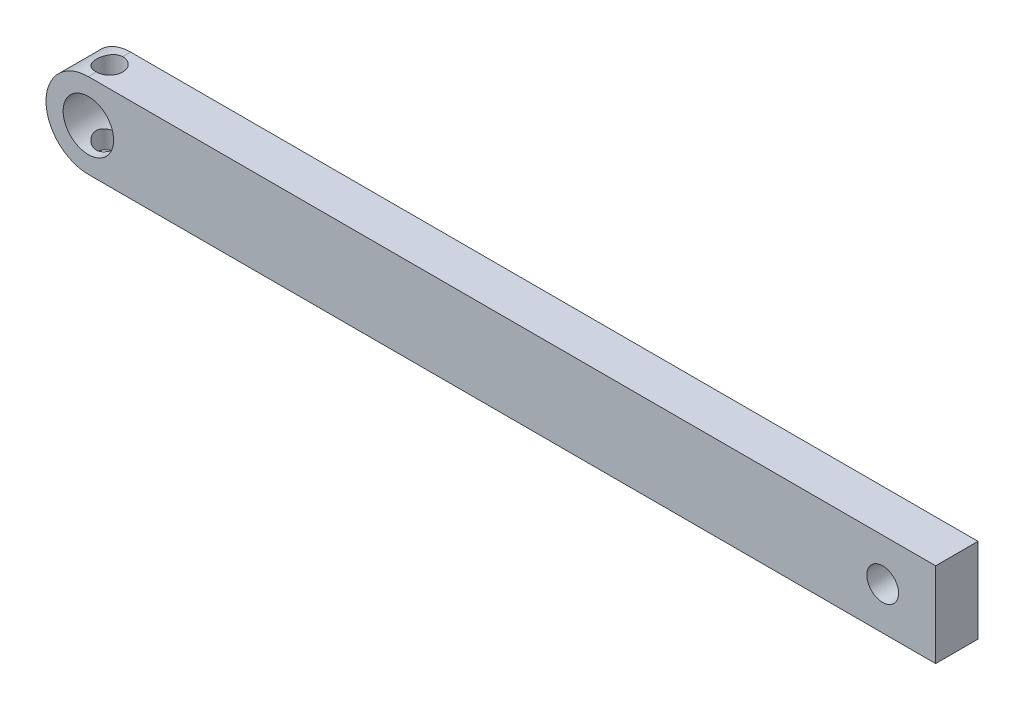
ISO-10303-21;
HEADER;
FILE_DESCRIPTION(('STEP AP214'),'2;1');
FILE_NAME('part.step','',(''),(''),'','','');
FILE_SCHEMA(('AUTOMOTIVE_DESIGN { 1 0 10303 214 1 1 1 1 }'));
ENDSEC;
DATA;
#1=APPLICATION_CONTEXT('core data for automotive mechanical design processes');
#2=APPLICATION_PROTOCOL_DEFINITION('international standard','automotive_design',2000,#1);
#3=PRODUCT_CONTEXT('',#1,'mechanical');
#4=PRODUCT('Part','Part','',(#3));
#5=PRODUCT_RELATED_PRODUCT_CATEGORY('part','',(#4));
#6=PRODUCT_DEFINITION_FORMATION('','',#4);
#7=PRODUCT_DEFINITION_CONTEXT('part definition',#1,'design');
#8=PRODUCT_DEFINITION('design','',#6,#7);
#9=PRODUCT_DEFINITION_SHAPE('','',#8);
#10=(LENGTH_UNIT() NAMED_UNIT(*) SI_UNIT(.MILLI.,.METRE.));
#11=(NAMED_UNIT(*) PLANE_ANGLE_UNIT() SI_UNIT($,.RADIAN.));
#12=(NAMED_UNIT(*) SI_UNIT($,.STERADIAN.) SOLID_ANGLE_UNIT());
#13=UNCERTAINTY_MEASURE_WITH_UNIT(LENGTH_MEASURE(1.E-05),#10,'distance_accuracy_value','');
#14=(GEOMETRIC_REPRESENTATION_CONTEXT(3) GLOBAL_UNCERTAINTY_ASSIGNED_CONTEXT((#13)) GLOBAL_UNIT_ASSIGNED_CONTEXT((#10,
#11,#12)) REPRESENTATION_CONTEXT('',''));
#15=CARTESIAN_POINT('',(0.,0.,0.));
#16=DIRECTION('',(0.,0.,1.));
#17=DIRECTION('',(1.,0.,0.));
#18=AXIS2_PLACEMENT_3D('',#15,#16,#17);
#19=CARTESIAN_POINT('',(0.,0.,8.00000000000001));
#20=DIRECTION('',(0.,0.,-1.));
#21=DIRECTION('',(-1.,0.,0.));
#22=AXIS2_PLACEMENT_3D('',#19,#20,#21);
#23=CYLINDRICAL_SURFACE('',#22,8.);
#24=DIRECTION('',(0.,0.,-1.));
#25=VECTOR('',#24,1.);
#26=CARTESIAN_POINT('',(0.,8.00000000000001,8.00000000000001));
#27=LINE('',#26,#25);
#28=CARTESIAN_POINT('',(0.,8.00000000000001,8.00000000000001));
#29=VERTEX_POINT('',#28);
#30=CARTESIAN_POINT('',(0.,8.00000000000001,6.50000000000001));
#31=VERTEX_POINT('',#30);
#32=EDGE_CURVE('E107',#29,#31,#27,.T.);
#33=ORIENTED_EDGE('',*,*,#32,.T.);
#34=CARTESIAN_POINT('',(0.,8.00000000000001,6.50000000000001));
#35=CARTESIAN_POINT('',(-0.0685487375897861,8.00000828551833,6.50000852601127));
#36=CARTESIAN_POINT('',(-0.137092243271783,7.9991191440238,6.49718079886828));
#37=CARTESIAN_POINT('',(-0.273658462709296,7.99560760801552,6.48591902577308));
#38=CARTESIAN_POINT('',(-0.341681282702897,7.99298557715255,6.47748615607071));
#39=CARTESIAN_POINT('',(-0.476556396287234,7.98607844882145,6.45510820487387));
#40=CARTESIAN_POINT('',(-0.543411188332166,7.98179751992038,6.44117693843149));
#41=CARTESIAN_POINT('',(-0.675634097513508,7.97169515696953,6.40793933067783));
#42=CARTESIAN_POINT('',(-0.741002181869404,7.96587368898799,6.38863287097261));
#43=CARTESIAN_POINT('',(-0.934159566213668,7.94632105573205,6.32288580706774));
#44=CARTESIAN_POINT('',(-1.05916451444987,7.9304927927943,6.26859025811366));
#45=CARTESIAN_POINT('',(-1.29825956099428,7.89488403622455,6.14078064523646));
#46=CARTESIAN_POINT('',(-1.41234491586354,7.87510183643384,6.06725828053436));
#47=CARTESIAN_POINT('',(-1.62992185834525,7.83300504863904,5.90069158717585));
#48=CARTESIAN_POINT('',(-1.73303308369391,7.81063554499911,5.80716348112159));
#49=CARTESIAN_POINT('',(-1.92239185222163,7.76620202095561,5.60426855583532));
#50=CARTESIAN_POINT('',(-2.00863537601001,7.74413807452404,5.49489797229329));
#51=CARTESIAN_POINT('',(-2.16388806855929,7.70222242976766,5.26010828060368));
#52=CARTESIAN_POINT('',(-2.23241866885748,7.68243887545916,5.1343593692775));
#53=CARTESIAN_POINT('',(-2.3471970391182,7.64815537243525,4.8724091713225));
#54=CARTESIAN_POINT('',(-2.39345168311052,7.63365379411742,4.73621112420152));
#55=CARTESIAN_POINT('',(-2.46096881223998,7.61215225423915,4.46154529903334));
#56=CARTESIAN_POINT('',(-2.48294172478264,7.60493961151813,4.32326926995985));
#57=CARTESIAN_POINT('',(-2.50349113691374,7.59820109395765,4.04481675400958));
#58=CARTESIAN_POINT('',(-2.5020733589136,7.59867333904976,3.90464074033881));
#59=CARTESIAN_POINT('',(-2.47643642308412,7.60706380493777,3.63225031409493));
#60=CARTESIAN_POINT('',(-2.45312089723513,7.61468692290453,3.49994023202207));
#61=CARTESIAN_POINT('',(-2.38581575576351,7.63604066973849,3.24121423761495));
#62=CARTESIAN_POINT('',(-2.34182417905605,7.64977187794003,3.11479888563529));
#63=CARTESIAN_POINT('',(-2.2337772364259,7.68202096695246,2.86929545704555));
#64=CARTESIAN_POINT('',(-2.16943794916688,7.70060589200765,2.75034152089711));
#65=CARTESIAN_POINT('',(-2.0227194142874,7.74043735773375,2.5246233151796));
#66=CARTESIAN_POINT('',(-1.94033567192367,7.7616845609936,2.41786209282603));
#67=CARTESIAN_POINT('',(-1.75544295442941,7.80562852096723,2.21445957784168));
#68=CARTESIAN_POINT('',(-1.6521896856372,7.82834727778429,2.11849843121897));
#69=CARTESIAN_POINT('',(-1.43074855532243,7.8718276191842,1.94507021527006));
#70=CARTESIAN_POINT('',(-1.31255688667029,7.89258870248027,1.86760787505452));
#71=CARTESIAN_POINT('',(-1.06326270590143,7.93003694109363,1.73290548098959));
#72=CARTESIAN_POINT('',(-0.932061262110442,7.94668888732126,1.67583843937543));
#73=CARTESIAN_POINT('',(-0.661347031903778,7.97377122873637,1.58485251978696));
#74=CARTESIAN_POINT('',(-0.521846759382405,7.98421074263933,1.55089970375208));
#75=CARTESIAN_POINT('',(-0.317524974590987,7.9939469560764,1.51942462400281));
#76=CARTESIAN_POINT('',(-0.254213573128759,7.99621235684532,1.51214152080404));
#77=CARTESIAN_POINT('',(-0.12727891834249,7.99923898062172,1.50243337115787));
#78=CARTESIAN_POINT('',(-0.0636562717724465,8.00000244442139,1.50000108752866));
#79=CARTESIAN_POINT('',(0.,8.00000000000004,1.49999999999989));
#80=B_SPLINE_CURVE_WITH_KNOTS('',3,(#34,#35,#36,#37,#38,#39,#40,#41,#42,#43,#44,#45,#46,#47,#48,
#49,#50,#51,#52,#53,#54,#55,#56,#57,#58,#59,#60,#61,#62,#63,#64,#65,#66,#67,#68,#69,#70,#71,#72,
#73,#74,#75,#76,#77,#78,#79),.UNSPECIFIED.,.F.,.F.,(4,2,2,2,2,2,2,2,2,2,2,2,2,2,2,2,2,2,2,2,2,2,
4),(0.,0.205573209983583,0.411103293652321,0.616120224939462,0.821141672284207,1.23069571854254,
1.64042687401617,2.06149251997569,2.4826583794019,2.91423219989317,3.34567275763244,
3.76412558310411,4.18247603777546,4.58428767511492,4.98613743123137,5.3938620529683,
5.80168835169545,6.22804332521303,6.6545071774636,7.08450732623744,7.51387474652565,
7.7050115487477,7.89586297038672),.UNSPECIFIED.);
#81=CARTESIAN_POINT('',(0.,8.00000000000001,1.5));
#82=VERTEX_POINT('',#81);
#83=EDGE_CURVE('E70',#31,#82,#80,.T.);
#84=ORIENTED_EDGE('',*,*,#83,.T.);
#85=CARTESIAN_POINT('',(0.,8.00000000000001,0.));
#86=VERTEX_POINT('',#85);
#87=EDGE_CURVE('E104',#82,#86,#27,.T.);
#88=ORIENTED_EDGE('',*,*,#87,.T.);
#89=CARTESIAN_POINT('',(0.,0.,0.));
#90=DIRECTION('',(0.,0.,1.));
#91=DIRECTION('',(1.,0.,0.));
#92=AXIS2_PLACEMENT_3D('',#89,#90,#91);
#93=CIRCLE('',#92,8.);
#94=CARTESIAN_POINT('',(0.,-7.99999999999979,0.));
#95=VERTEX_POINT('',#94);
#96=EDGE_CURVE('E174',#86,#95,#93,.T.);
#97=ORIENTED_EDGE('',*,*,#96,.T.);
#98=DIRECTION('',(0.,0.,-1.));
#99=VECTOR('',#98,1.);
#100=CARTESIAN_POINT('',(0.,-7.99999999999977,8.00000000000001));
#101=LINE('',#100,#99);
#102=CARTESIAN_POINT('',(0.,-7.99999999999979,1.5));
#103=VERTEX_POINT('',#102);
#104=EDGE_CURVE('E52',#103,#95,#101,.T.);
#105=ORIENTED_EDGE('',*,*,#104,.F.);
#106=CARTESIAN_POINT('',(0.,-7.99999999999979,1.5));
#107=CARTESIAN_POINT('',(-0.0685487375898396,-8.00000828551826,1.49999147398843));
#108=CARTESIAN_POINT('',(-0.137092243271868,-7.99911914402379,1.50281920113132));
#109=CARTESIAN_POINT('',(-0.273658462709395,-7.99560760801553,1.51408097422646));
#110=CARTESIAN_POINT('',(-0.341681282702979,-7.99298557715254,1.52251384392888));
#111=CARTESIAN_POINT('',(-0.476556396287318,-7.98607844882145,1.5448917951257));
#112=CARTESIAN_POINT('',(-0.543411188332272,-7.98179751992042,1.55882306156801));
#113=CARTESIAN_POINT('',(-0.675634097513566,-7.97169515696948,1.59206066932184));
#114=CARTESIAN_POINT('',(-0.741002181869393,-7.96587368898782,1.61136712902731));
#115=CARTESIAN_POINT('',(-0.934159566213624,-7.94632105573176,1.67711419293244));
#116=CARTESIAN_POINT('',(-1.05916451445006,-7.93049279279426,1.73140974188606));
#117=CARTESIAN_POINT('',(-1.29825956099448,-7.89488403622454,1.85921935476314));
#118=CARTESIAN_POINT('',(-1.41234491586352,-7.87510183643364,1.93274171946558));
#119=CARTESIAN_POINT('',(-1.62992185834524,-7.8330050486388,2.09930841282422));
#120=CARTESIAN_POINT('',(-1.73303308369413,-7.81063554499905,2.19283651887826));
#121=CARTESIAN_POINT('',(-1.92239185222187,-7.76620202095556,2.39573144416445));
#122=CARTESIAN_POINT('',(-2.00863537601003,-7.74413807452381,2.50510202770664));
#123=CARTESIAN_POINT('',(-2.16388806855926,-7.70222242976743,2.73989171939635));
#124=CARTESIAN_POINT('',(-2.23241866885763,-7.68243887545912,2.86564063072245));
#125=CARTESIAN_POINT('',(-2.34719703911838,-7.64815537243519,3.12759082867743));
#126=CARTESIAN_POINT('',(-2.39345168311057,-7.63365379411717,3.26378887579846));
#127=CARTESIAN_POINT('',(-2.46096881223994,-7.61215225423893,3.53845470096668));
#128=CARTESIAN_POINT('',(-2.48294172478265,-7.60493961151812,3.67673073004017));
#129=CARTESIAN_POINT('',(-2.50349113691379,-7.59820109395763,3.95518324599043));
#130=CARTESIAN_POINT('',(-2.50207335891365,-7.59867333904953,4.09535925966122));
#131=CARTESIAN_POINT('',(-2.47643642308408,-7.60706380493757,4.36774968590506));
#132=CARTESIAN_POINT('',(-2.45312089723501,-7.61468692290457,4.50005976797787));
#133=CARTESIAN_POINT('',(-2.38581575576342,-7.63604066973852,4.75878576238503));
#134=CARTESIAN_POINT('',(-2.34182417905608,-7.6497718779398,4.88520111436476));
#135=CARTESIAN_POINT('',(-2.23377723642588,-7.68202096695224,5.13070454295442));
#136=CARTESIAN_POINT('',(-2.16943794916669,-7.7006058920077,5.24965847910271));
#137=CARTESIAN_POINT('',(-2.02271941428722,-7.74043735773381,5.47537668482026));
#138=CARTESIAN_POINT('',(-1.94033567192367,-7.76168456099341,5.58213790717402));
#139=CARTESIAN_POINT('',(-1.75544295442942,-7.80562852096701,5.78554042215829));
#140=CARTESIAN_POINT('',(-1.65218968563702,-7.82834727778433,5.88150156878072));
#141=CARTESIAN_POINT('',(-1.43074855532224,-7.87182761918424,6.05492978472967));
#142=CARTESIAN_POINT('',(-1.31255688667027,-7.89258870248006,6.13239212494553));
#143=CARTESIAN_POINT('',(-1.06326270590145,-7.93003694109342,6.26709451901037));
#144=CARTESIAN_POINT('',(-0.932061262110334,-7.9466888873213,6.32416156062411));
#145=CARTESIAN_POINT('',(-0.661347031903657,-7.97377122873635,6.41514748021271));
#146=CARTESIAN_POINT('',(-0.5218467593824,-7.98421074263901,6.44910029624814));
#147=CARTESIAN_POINT('',(-0.317524974590986,-7.99394695607622,6.48057537599711));
#148=CARTESIAN_POINT('',(-0.254213573128736,-7.99621235684527,6.48785847919563));
#149=CARTESIAN_POINT('',(-0.127278918342441,-7.99923898062177,6.4975666288416));
#150=CARTESIAN_POINT('',(-0.0636562717723951,-8.00000244442142,6.49999891247085));
#151=CARTESIAN_POINT('',(0.,-7.99999999999981,6.50000000000012));
#152=B_SPLINE_CURVE_WITH_KNOTS('',3,(#106,#107,#108,#109,#110,#111,#112,#113,#114,#115,#116,
#117,#118,#119,#120,#121,#122,#123,#124,#125,#126,#127,#128,#129,#130,#131,#132,#133,#134,#135,
#136,#137,#138,#139,#140,#141,#142,#143,#144,#145,#146,#147,#148,#149,#150,#151),.UNSPECIFIED.,
.F.,.F.,(4,2,2,2,2,2,2,2,2,2,2,2,2,2,2,2,2,2,2,2,2,2,4),(0.,0.205573209983675,0.411103293652379,
0.616120224939516,0.821141672284316,1.23069571854268,1.64042687401635,2.06149251997589,
2.48265837940212,2.91423219989341,3.3456727576327,3.76412558310437,4.18247603777573,
4.58428767511517,4.9861374312316,5.39386205296851,5.80168835169564,6.2280433252132,
6.65450717746373,7.08450732623754,7.51387474652573,7.70501154874777,7.89586297038678),.UNSPECIFIED.);
#153=CARTESIAN_POINT('',(0.,-7.99999999999979,6.50000000000001));
#154=VERTEX_POINT('',#153);
#155=EDGE_CURVE('E58',#103,#154,#152,.T.);
#156=ORIENTED_EDGE('',*,*,#155,.T.);
#157=CARTESIAN_POINT('',(0.,-7.99999999999977,8.00000000000001));
#158=VERTEX_POINT('',#157);
#159=EDGE_CURVE('E11',#158,#154,#101,.T.);
#160=ORIENTED_EDGE('',*,*,#159,.F.);
#161=CARTESIAN_POINT('',(0.,0.,8.00000000000001));
#162=DIRECTION('',(0.,0.,1.));
#163=DIRECTION('',(1.,0.,0.));
#164=AXIS2_PLACEMENT_3D('',#161,#162,#163);
#165=CIRCLE('',#164,8.);
#166=EDGE_CURVE('E172',#29,#158,#165,.T.);
#167=ORIENTED_EDGE('',*,*,#166,.F.);
#168=EDGE_LOOP('',(#33,#84,#88,#97,#105,#156,#160,#167));
#169=FACE_BOUND('',#168,.T.);
#170=ADVANCED_FACE('F39',(#169),#23,.T.);
#171=CARTESIAN_POINT('',(0.,-7.99999999999977,8.00000000000001));
#172=DIRECTION('',(0.,1.,0.));
#173=DIRECTION('',(0.,0.,1.));
#174=AXIS2_PLACEMENT_3D('',#171,#172,#173);
#175=PLANE('',#174);
#176=ORIENTED_EDGE('',*,*,#159,.T.);
#177=CARTESIAN_POINT('',(0.,-7.99999999999979,4.));
#178=DIRECTION('',(0.,1.,0.));
#179=DIRECTION('',(0.,0.,1.));
#180=AXIS2_PLACEMENT_3D('',#177,#178,#179);
#181=CIRCLE('',#180,2.5);
#182=EDGE_CURVE('E108',#154,#103,#181,.T.);
#183=ORIENTED_EDGE('',*,*,#182,.T.);
#184=ORIENTED_EDGE('',*,*,#104,.T.);
#185=DIRECTION('',(1.,0.,0.));
#186=VECTOR('',#185,1.);
#187=CARTESIAN_POINT('',(0.,-7.99999999999979,0.));
#188=LINE('',#187,#186);
#189=CARTESIAN_POINT('',(160.,-7.99999999999977,0.));
#190=VERTEX_POINT('',#189);
#191=EDGE_CURVE('E185',#95,#190,#188,.T.);
#192=ORIENTED_EDGE('',*,*,#191,.T.);
#193=DIRECTION('',(0.,0.,-1.));
#194=VECTOR('',#193,1.);
#195=CARTESIAN_POINT('',(160.,-7.99999999999977,8.00000000000001));
#196=LINE('',#195,#194);
#197=CARTESIAN_POINT('',(160.,-7.99999999999977,8.00000000000001));
#198=VERTEX_POINT('',#197);
#199=EDGE_CURVE('E124',#198,#190,#196,.T.);
#200=ORIENTED_EDGE('',*,*,#199,.F.);
#201=DIRECTION('',(1.,0.,0.));
#202=VECTOR('',#201,1.);
#203=CARTESIAN_POINT('',(0.,-7.99999999999977,8.00000000000001));
#204=LINE('',#203,#202);
#205=EDGE_CURVE('E176',#158,#198,#204,.T.);
#206=ORIENTED_EDGE('',*,*,#205,.F.);
#207=EDGE_LOOP('',(#176,#183,#184,#192,#200,#206));
#208=FACE_BOUND('',#207,.T.);
#209=ADVANCED_FACE('F197',(#208),#175,.F.);
#210=CARTESIAN_POINT('',(160.,-7.99999999999977,8.00000000000001));
#211=DIRECTION('',(-1.,0.,0.));
#212=DIRECTION('',(0.,0.,1.));
#213=AXIS2_PLACEMENT_3D('',#210,#211,#212);
#214=PLANE('',#213);
#215=DIRECTION('',(0.,1.,0.));
#216=VECTOR('',#215,1.);
#217=CARTESIAN_POINT('',(160.,-7.99999999999977,0.));
#218=LINE('',#217,#216);
#219=CARTESIAN_POINT('',(160.,8.0000000000002,0.));
#220=VERTEX_POINT('',#219);
#221=EDGE_CURVE('E181',#190,#220,#218,.T.);
#222=ORIENTED_EDGE('',*,*,#221,.T.);
#223=DIRECTION('',(0.,0.,-1.));
#224=VECTOR('',#223,1.);
#225=CARTESIAN_POINT('',(160.,8.00000000000023,8.00000000000001));
#226=LINE('',#225,#224);
#227=CARTESIAN_POINT('',(160.,8.00000000000023,8.00000000000001));
#228=VERTEX_POINT('',#227);
#229=EDGE_CURVE('E116',#228,#220,#226,.T.);
#230=ORIENTED_EDGE('',*,*,#229,.F.);
#231=DIRECTION('',(0.,1.,0.));
#232=VECTOR('',#231,1.);
#233=CARTESIAN_POINT('',(160.,-7.99999999999977,8.00000000000001));
#234=LINE('',#233,#232);
#235=EDGE_CURVE('E119',#198,#228,#234,.T.);
#236=ORIENTED_EDGE('',*,*,#235,.F.);
#237=ORIENTED_EDGE('',*,*,#199,.T.);
#238=EDGE_LOOP('',(#222,#230,#236,#237));
#239=FACE_BOUND('',#238,.T.);
#240=ADVANCED_FACE('F190',(#239),#214,.F.);
#241=CARTESIAN_POINT('',(160.,8.00000000000023,8.00000000000001));
#242=DIRECTION('',(0.,-1.,0.));
#243=DIRECTION('',(0.,0.,-1.));
#244=AXIS2_PLACEMENT_3D('',#241,#242,#243);
#245=PLANE('',#244);
#246=ORIENTED_EDGE('',*,*,#87,.F.);
#247=CARTESIAN_POINT('',(0.,8.00000000000001,4.));
#248=DIRECTION('',(0.,-1.,0.));
#249=DIRECTION('',(0.,0.,-1.));
#250=AXIS2_PLACEMENT_3D('',#247,#248,#249);
#251=CIRCLE('',#250,2.5);
#252=EDGE_CURVE('E96',#82,#31,#251,.T.);
#253=ORIENTED_EDGE('',*,*,#252,.T.);
#254=ORIENTED_EDGE('',*,*,#32,.F.);
#255=DIRECTION('',(-1.,0.,0.));
#256=VECTOR('',#255,1.);
#257=CARTESIAN_POINT('',(160.,8.00000000000023,8.00000000000001));
#258=LINE('',#257,#256);
#259=EDGE_CURVE('E118',#228,#29,#258,.T.);
#260=ORIENTED_EDGE('',*,*,#259,.F.);
#261=ORIENTED_EDGE('',*,*,#229,.T.);
#262=DIRECTION('',(-1.,0.,0.));
#263=VECTOR('',#262,1.);
#264=CARTESIAN_POINT('',(160.,8.0000000000002,0.));
#265=LINE('',#264,#263);
#266=EDGE_CURVE('E111',#220,#86,#265,.T.);
#267=ORIENTED_EDGE('',*,*,#266,.T.);
#268=EDGE_LOOP('',(#246,#253,#254,#260,#261,#267));
#269=FACE_BOUND('',#268,.T.);
#270=ADVANCED_FACE('F112',(#269),#245,.F.);
#271=CARTESIAN_POINT('',(0.,0.,8.00000000000001));
#272=DIRECTION('',(0.,0.,1.));
#273=DIRECTION('',(1.,0.,0.));
#274=AXIS2_PLACEMENT_3D('',#271,#272,#273);
#275=PLANE('',#274);
#276=CARTESIAN_POINT('',(0.,0.,8.00000000000001));
#277=DIRECTION('',(0.,0.,1.));
#278=DIRECTION('',(1.,0.,0.));
#279=AXIS2_PLACEMENT_3D('',#276,#277,#278);
#280=CIRCLE('',#279,4.7625);
#281=CARTESIAN_POINT('',(4.7625,0.,8.00000000000001));
#282=VERTEX_POINT('',#281);
#283=EDGE_CURVE('E138',#282,#282,#280,.T.);
#284=ORIENTED_EDGE('',*,*,#283,.F.);
#285=EDGE_LOOP('',(#284));
#286=FACE_BOUND('',#285,.T.);
#287=CARTESIAN_POINT('',(150.,2.22044604925031E-13,8.00000000000001));
#288=DIRECTION('',(0.,0.,1.));
#289=DIRECTION('',(1.,0.,0.));
#290=AXIS2_PLACEMENT_3D('',#287,#288,#289);
#291=CIRCLE('',#290,2.99999999999999);
#292=CARTESIAN_POINT('',(153.,2.22044604925031E-13,8.00000000000001));
#293=VERTEX_POINT('',#292);
#294=EDGE_CURVE('E133',#293,#293,#291,.T.);
#295=ORIENTED_EDGE('',*,*,#294,.F.);
#296=EDGE_LOOP('',(#295));
#297=FACE_BOUND('',#296,.T.);
#298=ORIENTED_EDGE('',*,*,#166,.T.);
#299=ORIENTED_EDGE('',*,*,#205,.T.);
#300=ORIENTED_EDGE('',*,*,#235,.T.);
#301=ORIENTED_EDGE('',*,*,#259,.T.);
#302=EDGE_LOOP('',(#298,#299,#300,#301));
#303=FACE_BOUND('',#302,.T.);
#304=ADVANCED_FACE('F200',(#286,#297,#303),#275,.T.);
#305=CARTESIAN_POINT('',(0.,0.,0.));
#306=DIRECTION('',(0.,0.,1.));
#307=DIRECTION('',(1.,0.,0.));
#308=AXIS2_PLACEMENT_3D('',#305,#306,#307);
#309=PLANE('',#308);
#310=CARTESIAN_POINT('',(30.,0.,0.));
#311=DIRECTION('',(0.,0.,1.));
#312=DIRECTION('',(1.,0.,0.));
#313=AXIS2_PLACEMENT_3D('',#310,#311,#312);
#314=CIRCLE('',#313,4.00000000000001);
#315=CARTESIAN_POINT('',(34.,0.,0.));
#316=VERTEX_POINT('',#315);
#317=EDGE_CURVE('E135',#316,#316,#314,.T.);
#318=ORIENTED_EDGE('',*,*,#317,.T.);
#319=EDGE_LOOP('',(#318));
#320=FACE_BOUND('',#319,.T.);
#321=CARTESIAN_POINT('',(0.,0.,0.));
#322=DIRECTION('',(0.,0.,1.));
#323=DIRECTION('',(1.,0.,0.));
#324=AXIS2_PLACEMENT_3D('',#321,#322,#323);
#325=CIRCLE('',#324,4.7625);
#326=CARTESIAN_POINT('',(4.7625,0.,0.));
#327=VERTEX_POINT('',#326);
#328=EDGE_CURVE('E131',#327,#327,#325,.T.);
#329=ORIENTED_EDGE('',*,*,#328,.T.);
#330=EDGE_LOOP('',(#329));
#331=FACE_BOUND('',#330,.T.);
#332=CARTESIAN_POINT('',(150.,2.22044604925031E-13,0.));
#333=DIRECTION('',(0.,0.,1.));
#334=DIRECTION('',(1.,0.,0.));
#335=AXIS2_PLACEMENT_3D('',#332,#333,#334);
#336=CIRCLE('',#335,2.99999999999999);
#337=CARTESIAN_POINT('',(153.,2.22044604925031E-13,0.));
#338=VERTEX_POINT('',#337);
#339=EDGE_CURVE('E126',#338,#338,#336,.T.);
#340=ORIENTED_EDGE('',*,*,#339,.T.);
#341=EDGE_LOOP('',(#340));
#342=FACE_BOUND('',#341,.T.);
#343=ORIENTED_EDGE('',*,*,#96,.F.);
#344=ORIENTED_EDGE('',*,*,#266,.F.);
#345=ORIENTED_EDGE('',*,*,#221,.F.);
#346=ORIENTED_EDGE('',*,*,#191,.F.);
#347=EDGE_LOOP('',(#343,#344,#345,#346));
#348=FACE_BOUND('',#347,.T.);
#349=ADVANCED_FACE('F191',(#320,#331,#342,#348),#309,.F.);
#350=CARTESIAN_POINT('',(150.,2.22044604925031E-13,-20.0000000000001));
#351=DIRECTION('',(0.,0.,1.));
#352=DIRECTION('',(1.,0.,0.));
#353=AXIS2_PLACEMENT_3D('',#350,#351,#352);
#354=CYLINDRICAL_SURFACE('',#353,2.99999999999999);
#355=ORIENTED_EDGE('',*,*,#294,.T.);
#356=EDGE_LOOP('',(#355));
#357=FACE_BOUND('',#356,.T.);
#358=ORIENTED_EDGE('',*,*,#339,.F.);
#359=EDGE_LOOP('',(#358));
#360=FACE_BOUND('',#359,.T.);
#361=ADVANCED_FACE('F208',(#357,#360),#354,.F.);
#362=CARTESIAN_POINT('',(0.,0.,-20.0000000000001));
#363=DIRECTION('',(0.,0.,1.));
#364=DIRECTION('',(1.,0.,0.));
#365=AXIS2_PLACEMENT_3D('',#362,#363,#364);
#366=CYLINDRICAL_SURFACE('',#365,4.7625);
#367=CARTESIAN_POINT('',(0.,-4.76249999999978,6.50000000000001));
#368=CARTESIAN_POINT('',(-0.130627421225199,-4.7624912423158,6.49998987345156));
#369=CARTESIAN_POINT('',(-0.261392577954281,-4.75706877903839,6.4897011265117));
#370=CARTESIAN_POINT('',(-0.51900445088768,-4.73590787240181,6.44902144651768));
#371=CARTESIAN_POINT('',(-0.645844384851272,-4.7201525152521,6.41859755373719));
#372=CARTESIAN_POINT('',(-0.891501022140095,-4.67996420289099,6.33919283263622));
#373=CARTESIAN_POINT('',(-1.01034767016372,-4.65556606099747,6.29028640030535));
#374=CARTESIAN_POINT('',(-1.2379438202076,-4.6002867022367,6.17571688829303));
#375=CARTESIAN_POINT('',(-1.34669348083588,-4.56940558723178,6.11005407188919));
#376=CARTESIAN_POINT('',(-1.55892133995745,-4.50159635346766,5.95903300840501));
#377=CARTESIAN_POINT('',(-1.66160312776816,-4.46440625290162,5.87267527303705));
#378=CARTESIAN_POINT('',(-1.85177188990189,-4.38894458289408,5.68487950619877));
#379=CARTESIAN_POINT('',(-1.93924600469647,-4.35067212970637,5.58342884544023));
#380=CARTESIAN_POINT('',(-2.10422763598032,-4.27348021423747,5.35773768357491));
#381=CARTESIAN_POINT('',(-2.18018973516788,-4.23479802820829,5.23227908494838));
#382=CARTESIAN_POINT('',(-2.30963791504333,-4.16562294885068,4.96804993693213));
#383=CARTESIAN_POINT('',(-2.36314108926499,-4.13512383377318,4.82928961068694));
#384=CARTESIAN_POINT('',(-2.42324895025029,-4.09996952403738,4.61869668339688));
#385=CARTESIAN_POINT('',(-2.43967751578651,-4.09018641832969,4.55039690148345));
#386=CARTESIAN_POINT('',(-2.46677009527981,-4.07390549926451,4.41229300246428));
#387=CARTESIAN_POINT('',(-2.47743732586378,-4.06740585284111,4.34248974745268));
#388=CARTESIAN_POINT('',(-2.4928228070298,-4.05799501167304,4.20204144086744));
#389=CARTESIAN_POINT('',(-2.49754557969259,-4.05508108922652,4.13139707049882));
#390=CARTESIAN_POINT('',(-2.50098217922734,-4.05296092161596,3.98992993238122));
#391=CARTESIAN_POINT('',(-2.49969669147793,-4.0537542535553,3.91910718590124));
#392=CARTESIAN_POINT('',(-2.48799202626699,-4.06096295843848,3.72652657877533));
#393=CARTESIAN_POINT('',(-2.47160741979413,-4.07104911907529,3.60520413914163));
#394=CARTESIAN_POINT('',(-2.42171169462485,-4.10091839522591,3.36745556765119));
#395=CARTESIAN_POINT('',(-2.38819409172341,-4.1207051819516,3.25103130764252));
#396=CARTESIAN_POINT('',(-2.30445419048025,-4.16812330580348,3.0229734463351));
#397=CARTESIAN_POINT('',(-2.25386859885837,-4.19592314410563,2.9115094942428));
#398=CARTESIAN_POINT('',(-2.13771806028817,-4.25627134083851,2.69810002860173));
#399=CARTESIAN_POINT('',(-2.07214642279414,-4.28882181784705,2.59615879521024));
#400=CARTESIAN_POINT('',(-1.91707717493104,-4.36056222368119,2.38947796353902));
#401=CARTESIAN_POINT('',(-1.82550601334383,-4.40003945957635,2.28638795479857));
#402=CARTESIAN_POINT('',(-1.62631292573431,-4.47749235013777,2.09630005668344));
#403=CARTESIAN_POINT('',(-1.51868183519854,-4.51546713167985,2.00931141938992));
#404=CARTESIAN_POINT('',(-1.28285311381232,-4.58821726237061,1.84925644738104));
#405=CARTESIAN_POINT('',(-1.15384113644337,-4.62269422182366,1.77724297891855));
#406=CARTESIAN_POINT('',(-0.883274583487487,-4.68191671322411,1.65655951919258));
#407=CARTESIAN_POINT('',(-0.74173102174264,-4.7066706885483,1.60786926609566));
#408=CARTESIAN_POINT('',(-0.463482648356793,-4.74178157874737,1.53954031968046));
#409=CARTESIAN_POINT('',(-0.327451533146038,-4.7532154346413,1.51771868966592));
#410=CARTESIAN_POINT('',(-0.0532027411688885,-4.76417535094782,1.49679213134935));
#411=CARTESIAN_POINT('',(0.0850136913179716,-4.76370795984328,1.49767471039916));
#412=CARTESIAN_POINT('',(0.346844432807818,-4.75150400862076,1.52099639780689));
#413=CARTESIAN_POINT('',(0.470680368684716,-4.74075451239976,1.54154746222716));
#414=CARTESIAN_POINT('',(0.712860226199099,-4.710428305764,1.60054849782005));
#415=CARTESIAN_POINT('',(0.831203566825294,-4.69085066383721,1.63900035782974));
#416=CARTESIAN_POINT('',(1.06265581547703,-4.64397292939111,1.73354813372296));
#417=CARTESIAN_POINT('',(1.17554845250721,-4.61648518425673,1.79007704285098));
#418=CARTESIAN_POINT('',(1.3905852479921,-4.55633242252804,1.91865766067254));
#419=CARTESIAN_POINT('',(1.49272507029363,-4.52366533052962,1.99071559614232));
#420=CARTESIAN_POINT('',(1.69480039032758,-4.45215890340858,2.15703140527532));
#421=CARTESIAN_POINT('',(1.79336890820244,-4.41303191650159,2.25282863641815));
#422=CARTESIAN_POINT('',(1.97371435217992,-4.335379867376,2.45945426227599));
#423=CARTESIAN_POINT('',(2.05547672343992,-4.29685535337568,2.57029554902649));
#424=CARTESIAN_POINT('',(2.20479830589219,-4.22228238623125,2.81242933141259));
#425=CARTESIAN_POINT('',(2.27115503352743,-4.18653780097841,2.94456580727013));
#426=CARTESIAN_POINT('',(2.37999935200254,-4.12564529058874,3.22056006413422));
#427=CARTESIAN_POINT('',(2.42252029102062,-4.10048257295406,3.36440114495439));
#428=CARTESIAN_POINT('',(2.47834245295764,-4.06696362690633,3.64475999823968));
#429=CARTESIAN_POINT('',(2.49409685007316,-4.05720315494867,3.78061598885196));
#430=CARTESIAN_POINT('',(2.50314491556988,-4.05163151557572,4.05332748016955));
#431=CARTESIAN_POINT('',(2.49645222775032,-4.05581187462823,4.19018232328899));
#432=CARTESIAN_POINT('',(2.46314240917375,-4.0761044427219,4.44436756061725));
#433=CARTESIAN_POINT('',(2.4388959035515,-4.09079472815576,4.56213845785961));
#434=CARTESIAN_POINT('',(2.37431443322135,-4.12861104406671,4.79174715741084));
#435=CARTESIAN_POINT('',(2.33397375533869,-4.15174006991272,4.90358283682163));
#436=CARTESIAN_POINT('',(2.2354412006694,-4.20565680812152,5.12632056134562));
#437=CARTESIAN_POINT('',(2.17625269942792,-4.23684709813605,5.23668110140829));
#438=CARTESIAN_POINT('',(2.04272583561228,-4.30281595857224,5.44664149205035));
#439=CARTESIAN_POINT('',(1.96837932494081,-4.33759645390193,5.54623551090399));
#440=CARTESIAN_POINT('',(1.79459058186513,-4.41259367454213,5.74623301081812));
#441=CARTESIAN_POINT('',(1.69309805784767,-4.45289552478304,5.84483418246093));
#442=CARTESIAN_POINT('',(1.4741187981977,-4.53010856140782,6.02411107621548));
#443=CARTESIAN_POINT('',(1.35662228435691,-4.56701765159221,6.10477575944964));
#444=CARTESIAN_POINT('',(1.10544584264606,-4.63427836398823,6.24703138695317));
#445=CARTESIAN_POINT('',(0.97149587969822,-4.66448867543804,6.3082213726476));
#446=CARTESIAN_POINT('',(0.763036809787661,-4.70151003933914,6.38185263488793));
#447=CARTESIAN_POINT('',(0.692342196853569,-4.7124638003584,6.40336283397355));
#448=CARTESIAN_POINT('',(0.548955469041285,-4.73130690436656,6.4401049441724));
#449=CARTESIAN_POINT('',(0.476264516496291,-4.73919799167272,6.45534042929371));
#450=CARTESIAN_POINT('',(0.336490962938897,-4.7510655397767,6.47816521482263));
#451=CARTESIAN_POINT('',(0.269529218241722,-4.75534196795001,6.48634201550884));
#452=CARTESIAN_POINT('',(0.135057265858502,-4.76106149016356,6.49726207964461));
#453=CARTESIAN_POINT('',(0.0675470474296347,-4.76250452857188,6.50000523640781));
#454=CARTESIAN_POINT('',(0.,-4.76249999999978,6.50000000000001));
#455=B_SPLINE_CURVE_WITH_KNOTS('',3,(#367,#368,#369,#370,#371,#372,#373,#374,#375,#376,#377,
#378,#379,#380,#381,#382,#383,#384,#385,#386,#387,#388,#389,#390,#391,#392,#393,#394,#395,#396,
#397,#398,#399,#400,#401,#402,#403,#404,#405,#406,#407,#408,#409,#410,#411,#412,#413,#414,#415,
#416,#417,#418,#419,#420,#421,#422,#423,#424,#425,#426,#427,#428,#429,#430,#431,#432,#433,#434,
#435,#436,#437,#438,#439,#440,#441,#442,#443,#444,#445,#446,#447,#448,#449,#450,#451,#452,#453,
#454),.UNSPECIFIED.,.T.,.F.,(4,2,2,2,2,2,2,2,2,2,2,2,2,2,2,2,2,2,2,2,2,2,2,2,2,2,2,2,2,2,2,2,2,
2,2,2,2,2,2,2,2,2,2,4),(0.,0.391620082278675,0.783882808141697,1.17458312940988,
1.56527731234242,1.98125165511734,2.3975760506315,2.85038836854076,3.30285542243421,
3.51536409838188,3.72775400505117,3.93998224417449,4.15218627443477,4.51879860111635,
4.88554977983671,5.26065926095981,5.6359365386283,6.06437983295351,6.49306855787098,
6.94577147619018,7.39808039643919,7.81050976496991,8.22271220532542,8.59894014659639,
8.97520779528728,9.36126420535273,9.74747570398928,10.1743931854573,10.6016788522687,
11.0555893773159,11.5088632499592,11.9177593954284,12.3264070504747,12.6882353422643,
13.0501921917827,13.4358699623553,13.8217556009127,14.2611437594709,14.7008015922909,
15.1490000544963,15.3728142955346,15.5965008775434,15.7990024706602,16.0015080397357),.UNSPECIFIED.);
#456=CARTESIAN_POINT('',(0.,-4.76249999999978,6.50000000000001));
#457=VERTEX_POINT('',#456);
#458=EDGE_CURVE('E43',#457,#457,#455,.T.);
#459=ORIENTED_EDGE('',*,*,#458,.T.);
#460=EDGE_LOOP('',(#459));
#461=FACE_BOUND('',#460,.T.);
#462=CARTESIAN_POINT('',(0.,4.7625,6.50000000000001));
#463=CARTESIAN_POINT('',(0.130627421225188,4.76249124231614,6.49998987345156));
#464=CARTESIAN_POINT('',(0.261392577954258,4.75706877903842,6.48970112651171));
#465=CARTESIAN_POINT('',(0.519004450887666,4.73590787240178,6.44902144651768));
#466=CARTESIAN_POINT('',(0.64584438485128,4.72015251525231,6.41859755373718));
#467=CARTESIAN_POINT('',(0.891501022140088,4.67996420289122,6.33919283263623));
#468=CARTESIAN_POINT('',(1.01034767016368,4.65556606099749,6.29028640030537));
#469=CARTESIAN_POINT('',(1.23794382020756,4.60028670223671,6.17571688829305));
#470=CARTESIAN_POINT('',(1.34669348083588,4.56940558723199,6.11005407188918));
#471=CARTESIAN_POINT('',(1.55892133995746,4.50159635346789,5.95903300840501));
#472=CARTESIAN_POINT('',(1.66160312776812,4.46440625290164,5.87267527303709));
#473=CARTESIAN_POINT('',(1.85177188990184,4.3889445828941,5.68487950619881));
#474=CARTESIAN_POINT('',(1.93924600469646,4.3506721297066,5.58342884544023));
#475=CARTESIAN_POINT('',(2.10422763598032,4.27348021423771,5.3577376835749));
#476=CARTESIAN_POINT('',(2.18018973516786,4.23479802820828,5.23227908494843));
#477=CARTESIAN_POINT('',(2.3096379150433,4.16562294885072,4.96804993693218));
#478=CARTESIAN_POINT('',(2.36314108926499,4.13512383377349,4.82928961068693));
#479=CARTESIAN_POINT('',(2.42324895025029,4.09996952403756,4.61869668339688));
#480=CARTESIAN_POINT('',(2.43967751578651,4.09018641832973,4.55039690148346));
#481=CARTESIAN_POINT('',(2.46677009527981,4.07390549926446,4.4122930024643));
#482=CARTESIAN_POINT('',(2.47743732586377,4.06740585284111,4.3424897474527));
#483=CARTESIAN_POINT('',(2.4928228070298,4.05799501167304,4.20204144086745));
#484=CARTESIAN_POINT('',(2.49754557969259,4.05508108922647,4.13139707049883));
#485=CARTESIAN_POINT('',(2.50098217922734,4.05296092161601,3.98992993238123));
#486=CARTESIAN_POINT('',(2.49969669147793,4.0537542535555,3.91910718590125));
#487=CARTESIAN_POINT('',(2.48799202626699,4.06096295843877,3.72652657877533));
#488=CARTESIAN_POINT('',(2.47160741979412,4.07104911907532,3.6052041391416));
#489=CARTESIAN_POINT('',(2.42171169462484,4.10091839522589,3.36745556765116));
#490=CARTESIAN_POINT('',(2.38819409172342,4.12070518195181,3.25103130764253));
#491=CARTESIAN_POINT('',(2.30445419048024,4.16812330580371,3.0229734463351));
#492=CARTESIAN_POINT('',(2.25386859885835,4.19592314410565,2.91150949424276));
#493=CARTESIAN_POINT('',(2.13771806028815,4.25627134083852,2.69810002860168));
#494=CARTESIAN_POINT('',(2.07214642279414,4.28882181784725,2.59615879521024));
#495=CARTESIAN_POINT('',(1.91707717493104,4.36056222368143,2.38947796353902));
#496=CARTESIAN_POINT('',(1.82550601334379,4.40003945957637,2.28638795479853));
#497=CARTESIAN_POINT('',(1.62631292573427,4.47749235013777,2.0963000566834));
#498=CARTESIAN_POINT('',(1.51868183519854,4.51546713168005,2.00931141938991));
#499=CARTESIAN_POINT('',(1.28285311381233,4.58821726237082,1.84925644738104));
#500=CARTESIAN_POINT('',(1.15384113644334,4.62269422182366,1.77724297891853));
#501=CARTESIAN_POINT('',(0.883274583487447,4.68191671322413,1.65655951919256));
#502=CARTESIAN_POINT('',(0.741731021742633,4.70667068854853,1.60786926609565));
#503=CARTESIAN_POINT('',(0.463482648356801,4.74178157874757,1.53954031968046));
#504=CARTESIAN_POINT('',(0.327451533146034,4.7532154346413,1.51771868966592));
#505=CARTESIAN_POINT('',(0.053202741168875,4.76417535094783,1.49679213134935));
#506=CARTESIAN_POINT('',(-0.0850136913179833,4.76370795984351,1.49767471039916));
#507=CARTESIAN_POINT('',(-0.346844432807808,4.75150400862097,1.52099639780688));
#508=CARTESIAN_POINT('',(-0.470680368684689,4.74075451239976,1.54154746222715));
#509=CARTESIAN_POINT('',(-0.712860226199079,4.710428305764,1.60054849782005));
#510=CARTESIAN_POINT('',(-0.831203566825299,4.69085066383741,1.63900035782975));
#511=CARTESIAN_POINT('',(-1.06265581547703,4.64397292939133,1.73354813372295));
#512=CARTESIAN_POINT('',(-1.17554845250717,4.61648518425674,1.79007704285095));
#513=CARTESIAN_POINT('',(-1.39058524799206,4.55633242252805,1.91865766067252));
#514=CARTESIAN_POINT('',(-1.49272507029363,4.52366533052981,1.99071559614233));
#515=CARTESIAN_POINT('',(-1.69480039032759,4.4521589034088,2.15703140527532));
#516=CARTESIAN_POINT('',(-1.79336890820241,4.4130319165016,2.25282863641811));
#517=CARTESIAN_POINT('',(-1.97371435217988,4.33537986737602,2.45945426227595));
#518=CARTESIAN_POINT('',(-2.05547672343992,4.2968553533759,2.57029554902649));
#519=CARTESIAN_POINT('',(-2.2047983058922,4.22228238623148,2.8124293314126));
#520=CARTESIAN_POINT('',(-2.27115503352742,4.18653780097842,2.9445658072701));
#521=CARTESIAN_POINT('',(-2.37999935200252,4.12564529058876,3.22056006413418));
#522=CARTESIAN_POINT('',(-2.42252029102061,4.1004825729543,3.36440114495438));
#523=CARTESIAN_POINT('',(-2.47834245295765,4.06696362690653,3.64475999823969));
#524=CARTESIAN_POINT('',(-2.49409685007316,4.05720315494866,3.78061598885196));
#525=CARTESIAN_POINT('',(-2.50314491556988,4.05163151557572,4.05332748016954));
#526=CARTESIAN_POINT('',(-2.49645222775032,4.05581187462846,4.19018232328898));
#527=CARTESIAN_POINT('',(-2.46314240917374,4.07610444272211,4.44436756061726));
#528=CARTESIAN_POINT('',(-2.43889590355149,4.09079472815577,4.56213845785965));
#529=CARTESIAN_POINT('',(-2.37431443322134,4.12861104406672,4.79174715741087));
#530=CARTESIAN_POINT('',(-2.3339737553387,4.15174006991293,4.90358283682163));
#531=CARTESIAN_POINT('',(-2.2354412006694,4.20565680812176,5.12632056134562));
#532=CARTESIAN_POINT('',(-2.17625269942788,4.23684709813607,5.23668110140833));
#533=CARTESIAN_POINT('',(-2.04272583561226,4.30281595857224,5.4466414920504));
#534=CARTESIAN_POINT('',(-1.96837932494081,4.33759645390213,5.54623551090399));
#535=CARTESIAN_POINT('',(-1.79459058186513,4.41259367454237,5.74623301081811));
#536=CARTESIAN_POINT('',(-1.69309805784762,4.45289552478306,5.84483418246096));
#537=CARTESIAN_POINT('',(-1.47411879819766,4.53010856140783,6.02411107621552));
#538=CARTESIAN_POINT('',(-1.35662228435691,4.56701765159242,6.10477575944965));
#539=CARTESIAN_POINT('',(-1.10544584264606,4.63427836398849,6.24703138695316));
#540=CARTESIAN_POINT('',(-0.971495879698197,4.66448867543814,6.30822137264761));
#541=CARTESIAN_POINT('',(-0.76303680978762,4.70151003933911,6.38185263488795));
#542=CARTESIAN_POINT('',(-0.692342196853526,4.71246380035834,6.40336283397357));
#543=CARTESIAN_POINT('',(-0.548955469041258,4.73130690436663,6.44010494417241));
#544=CARTESIAN_POINT('',(-0.476264516496284,4.73919799167295,6.45534042929371));
#545=CARTESIAN_POINT('',(-0.336490962938899,4.75106553977689,6.47816521482263));
#546=CARTESIAN_POINT('',(-0.269529218241715,4.75534196795001,6.48634201550884));
#547=CARTESIAN_POINT('',(-0.135057265858491,4.76106149016356,6.49726207964461));
#548=CARTESIAN_POINT('',(-0.0675470474296291,4.76250452857204,6.50000523640781));
#549=CARTESIAN_POINT('',(0.,4.7625,6.50000000000001));
#550=B_SPLINE_CURVE_WITH_KNOTS('',3,(#462,#463,#464,#465,#466,#467,#468,#469,#470,#471,#472,
#473,#474,#475,#476,#477,#478,#479,#480,#481,#482,#483,#484,#485,#486,#487,#488,#489,#490,#491,
#492,#493,#494,#495,#496,#497,#498,#499,#500,#501,#502,#503,#504,#505,#506,#507,#508,#509,#510,
#511,#512,#513,#514,#515,#516,#517,#518,#519,#520,#521,#522,#523,#524,#525,#526,#527,#528,#529,
#530,#531,#532,#533,#534,#535,#536,#537,#538,#539,#540,#541,#542,#543,#544,#545,#546,#547,#548,
#549),.UNSPECIFIED.,.T.,.F.,(4,2,2,2,2,2,2,2,2,2,2,2,2,2,2,2,2,2,2,2,2,2,2,2,2,2,2,2,2,2,2,2,2,
2,2,2,2,2,2,2,2,2,2,4),(0.,0.391620082278666,0.78388280814168,1.17458312940985,1.56527731234239,
1.9812516551173,2.39757605063146,2.85038836854073,3.30285542243419,3.51536409838187,
3.72775400505116,3.93998224417448,4.15218627443479,4.51879860111637,4.88554977983674,
5.26065926095984,5.63593653862834,6.06437983295355,6.49306855787101,6.94577147619021,
7.39808039643922,7.81050976496993,8.22271220532543,8.59894014659639,8.97520779528728,
9.36126420535272,9.74747570398926,10.1743931854573,10.6016788522687,11.0555893773159,
11.5088632499592,11.9177593954285,12.3264070504747,12.6882353422643,13.0501921917828,
13.4358699623553,13.8217556009128,14.2611437594709,14.700801592291,15.1490000544963,
15.3728142955346,15.5965008775434,15.7990024706602,16.0015080397357),.UNSPECIFIED.);
#551=CARTESIAN_POINT('',(0.,4.7625,6.50000000000001));
#552=VERTEX_POINT('',#551);
#553=EDGE_CURVE('E137',#552,#552,#550,.T.);
#554=ORIENTED_EDGE('',*,*,#553,.T.);
#555=EDGE_LOOP('',(#554));
#556=FACE_BOUND('',#555,.T.);
#557=ORIENTED_EDGE('',*,*,#283,.T.);
#558=EDGE_LOOP('',(#557));
#559=FACE_BOUND('',#558,.T.);
#560=ORIENTED_EDGE('',*,*,#328,.F.);
#561=EDGE_LOOP('',(#560));
#562=FACE_BOUND('',#561,.T.);
#563=ADVANCED_FACE('F145',(#461,#556,#559,#562),#366,.F.);
#564=CARTESIAN_POINT('',(30.,0.,-0.5));
#565=DIRECTION('',(0.,0.,1.));
#566=DIRECTION('',(1.,0.,0.));
#567=AXIS2_PLACEMENT_3D('',#564,#565,#566);
#568=CYLINDRICAL_SURFACE('',#567,4.00000000000001);
#569=CARTESIAN_POINT('',(30.,0.,0.5));
#570=DIRECTION('',(0.,0.,1.));
#571=DIRECTION('',(1.,0.,0.));
#572=AXIS2_PLACEMENT_3D('',#569,#570,#571);
#573=CIRCLE('',#572,4.00000000000001);
#574=CARTESIAN_POINT('',(34.,0.,0.5));
#575=VERTEX_POINT('',#574);
#576=EDGE_CURVE('E136',#575,#575,#573,.T.);
#577=ORIENTED_EDGE('',*,*,#576,.T.);
#578=EDGE_LOOP('',(#577));
#579=FACE_BOUND('',#578,.T.);
#580=ORIENTED_EDGE('',*,*,#317,.F.);
#581=EDGE_LOOP('',(#580));
#582=FACE_BOUND('',#581,.T.);
#583=ADVANCED_FACE('F250',(#579,#582),#568,.F.);
#584=CARTESIAN_POINT('',(30.,0.,0.5));
#585=DIRECTION('',(0.,0.,1.));
#586=DIRECTION('',(1.,0.,0.));
#587=AXIS2_PLACEMENT_3D('',#584,#585,#586);
#588=PLANE('',#587);
#589=ORIENTED_EDGE('',*,*,#576,.F.);
#590=EDGE_LOOP('',(#589));
#591=FACE_BOUND('',#590,.T.);
#592=ADVANCED_FACE('F153',(#591),#588,.F.);
#593=CARTESIAN_POINT('',(0.,-19.9999999999998,3.99999999999978));
#594=DIRECTION('',(0.,1.,0.));
#595=DIRECTION('',(0.,0.,1.));
#596=AXIS2_PLACEMENT_3D('',#593,#594,#595);
#597=CYLINDRICAL_SURFACE('',#596,2.5);
#598=ORIENTED_EDGE('',*,*,#553,.F.);
#599=EDGE_LOOP('',(#598));
#600=FACE_BOUND('',#599,.T.);
#601=ORIENTED_EDGE('',*,*,#252,.F.);
#602=ORIENTED_EDGE('',*,*,#83,.F.);
#603=EDGE_LOOP('',(#601,#602));
#604=FACE_BOUND('',#603,.T.);
#605=ADVANCED_FACE('F100',(#600,#604),#597,.F.);
#606=ORIENTED_EDGE('',*,*,#458,.F.);
#607=EDGE_LOOP('',(#606));
#608=FACE_BOUND('',#607,.T.);
#609=ORIENTED_EDGE('',*,*,#182,.F.);
#610=ORIENTED_EDGE('',*,*,#155,.F.);
#611=EDGE_LOOP('',(#609,#610));
#612=FACE_BOUND('',#611,.T.);
#613=ADVANCED_FACE('F146',(#608,#612),#597,.F.);
#614=CLOSED_SHELL('',(#170,#209,#240,#270,#304,#349,#361,#563,#583,#592,#605,#613));
#615=MANIFOLD_SOLID_BREP('B2',#614);
#616=ADVANCED_BREP_SHAPE_REPRESENTATION('',(#18,#615),#14);
#617=SHAPE_DEFINITION_REPRESENTATION(#9,#616);
ENDSEC;
END-ISO-10303-21;
